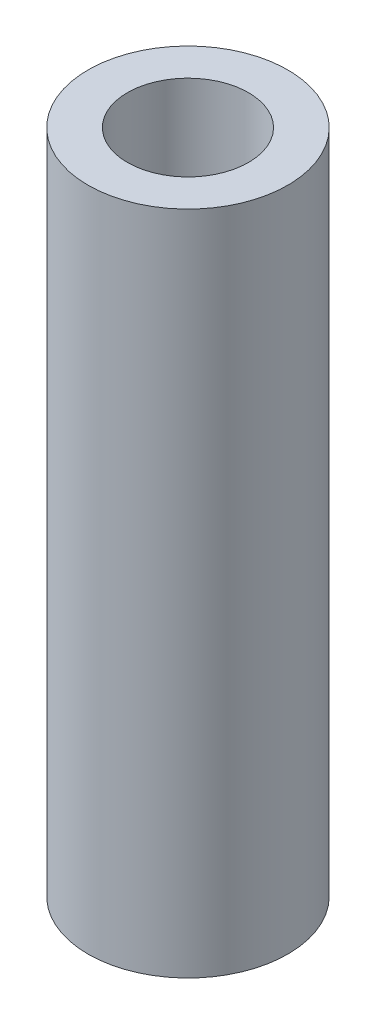
ISO-10303-21;
HEADER;
FILE_DESCRIPTION(('STEP AP214'),'2;1');
FILE_NAME('part.step','',(''),(''),'','','');
FILE_SCHEMA(('AUTOMOTIVE_DESIGN { 1 0 10303 214 1 1 1 1 }'));
ENDSEC;
DATA;
#1=APPLICATION_CONTEXT('core data for automotive mechanical design processes');
#2=APPLICATION_PROTOCOL_DEFINITION('international standard','automotive_design',2000,#1);
#3=PRODUCT_CONTEXT('',#1,'mechanical');
#4=PRODUCT('Part','Part','',(#3));
#5=PRODUCT_RELATED_PRODUCT_CATEGORY('part','',(#4));
#6=PRODUCT_DEFINITION_FORMATION('','',#4);
#7=PRODUCT_DEFINITION_CONTEXT('part definition',#1,'design');
#8=PRODUCT_DEFINITION('design','',#6,#7);
#9=PRODUCT_DEFINITION_SHAPE('','',#8);
#10=(LENGTH_UNIT() NAMED_UNIT(*) SI_UNIT(.MILLI.,.METRE.));
#11=(NAMED_UNIT(*) PLANE_ANGLE_UNIT() SI_UNIT($,.RADIAN.));
#12=(NAMED_UNIT(*) SI_UNIT($,.STERADIAN.) SOLID_ANGLE_UNIT());
#13=UNCERTAINTY_MEASURE_WITH_UNIT(LENGTH_MEASURE(1.E-05),#10,'distance_accuracy_value','');
#14=(GEOMETRIC_REPRESENTATION_CONTEXT(3) GLOBAL_UNCERTAINTY_ASSIGNED_CONTEXT((#13)) GLOBAL_UNIT_ASSIGNED_CONTEXT((#10,
#11,#12)) REPRESENTATION_CONTEXT('',''));
#15=CARTESIAN_POINT('',(0.,0.,0.));
#16=DIRECTION('',(0.,0.,1.));
#17=DIRECTION('',(1.,0.,0.));
#18=AXIS2_PLACEMENT_3D('',#15,#16,#17);
#19=CARTESIAN_POINT('',(0.,11.,0.));
#20=DIRECTION('',(0.,1.,0.));
#21=DIRECTION('',(0.,0.,1.));
#22=AXIS2_PLACEMENT_3D('',#19,#20,#21);
#23=PLANE('',#22);
#24=CARTESIAN_POINT('',(0.,11.,0.));
#25=DIRECTION('',(0.,1.,0.));
#26=DIRECTION('',(0.,0.,1.));
#27=AXIS2_PLACEMENT_3D('',#24,#25,#26);
#28=CIRCLE('',#27,1.65);
#29=CARTESIAN_POINT('',(0.,11.,1.65));
#30=VERTEX_POINT('',#29);
#31=EDGE_CURVE('E10',#30,#30,#28,.T.);
#32=ORIENTED_EDGE('',*,*,#31,.T.);
#33=EDGE_LOOP('',(#32));
#34=FACE_BOUND('',#33,.T.);
#35=CARTESIAN_POINT('',(0.,11.,0.));
#36=DIRECTION('',(0.,1.,0.));
#37=DIRECTION('',(0.,0.,1.));
#38=AXIS2_PLACEMENT_3D('',#35,#36,#37);
#39=CIRCLE('',#38,1.);
#40=CARTESIAN_POINT('',(0.,11.,1.));
#41=VERTEX_POINT('',#40);
#42=EDGE_CURVE('E44',#41,#41,#39,.T.);
#43=ORIENTED_EDGE('',*,*,#42,.F.);
#44=EDGE_LOOP('',(#43));
#45=FACE_BOUND('',#44,.T.);
#46=ADVANCED_FACE('F33',(#34,#45),#23,.T.);
#47=CARTESIAN_POINT('',(0.,0.,0.));
#48=DIRECTION('',(0.,1.,0.));
#49=DIRECTION('',(0.,0.,1.));
#50=AXIS2_PLACEMENT_3D('',#47,#48,#49);
#51=PLANE('',#50);
#52=CARTESIAN_POINT('',(0.,0.,0.));
#53=DIRECTION('',(0.,1.,0.));
#54=DIRECTION('',(0.,0.,1.));
#55=AXIS2_PLACEMENT_3D('',#52,#53,#54);
#56=CIRCLE('',#55,1.65);
#57=CARTESIAN_POINT('',(0.,0.,1.65));
#58=VERTEX_POINT('',#57);
#59=EDGE_CURVE('E37',#58,#58,#56,.T.);
#60=ORIENTED_EDGE('',*,*,#59,.F.);
#61=EDGE_LOOP('',(#60));
#62=FACE_BOUND('',#61,.T.);
#63=CARTESIAN_POINT('',(0.,0.,0.));
#64=DIRECTION('',(0.,1.,0.));
#65=DIRECTION('',(0.,0.,1.));
#66=AXIS2_PLACEMENT_3D('',#63,#64,#65);
#67=CIRCLE('',#66,1.);
#68=CARTESIAN_POINT('',(0.,0.,1.));
#69=VERTEX_POINT('',#68);
#70=EDGE_CURVE('E46',#69,#69,#67,.T.);
#71=ORIENTED_EDGE('',*,*,#70,.T.);
#72=EDGE_LOOP('',(#71));
#73=FACE_BOUND('',#72,.T.);
#74=ADVANCED_FACE('F56',(#62,#73),#51,.F.);
#75=CARTESIAN_POINT('',(0.,11.,0.));
#76=DIRECTION('',(0.,-1.,0.));
#77=DIRECTION('',(0.,0.,-1.));
#78=AXIS2_PLACEMENT_3D('',#75,#76,#77);
#79=CYLINDRICAL_SURFACE('',#78,1.65);
#80=ORIENTED_EDGE('',*,*,#31,.F.);
#81=EDGE_LOOP('',(#80));
#82=FACE_BOUND('',#81,.T.);
#83=ORIENTED_EDGE('',*,*,#59,.T.);
#84=EDGE_LOOP('',(#83));
#85=FACE_BOUND('',#84,.T.);
#86=ADVANCED_FACE('F35',(#82,#85),#79,.T.);
#87=CARTESIAN_POINT('',(0.,11.,0.));
#88=DIRECTION('',(0.,-1.,0.));
#89=DIRECTION('',(0.,0.,-1.));
#90=AXIS2_PLACEMENT_3D('',#87,#88,#89);
#91=CYLINDRICAL_SURFACE('',#90,1.);
#92=ORIENTED_EDGE('',*,*,#42,.T.);
#93=EDGE_LOOP('',(#92));
#94=FACE_BOUND('',#93,.T.);
#95=ORIENTED_EDGE('',*,*,#70,.F.);
#96=EDGE_LOOP('',(#95));
#97=FACE_BOUND('',#96,.T.);
#98=ADVANCED_FACE('F52',(#94,#97),#91,.F.);
#99=CLOSED_SHELL('',(#46,#74,#86,#98));
#100=MANIFOLD_SOLID_BREP('B2',#99);
#101=ADVANCED_BREP_SHAPE_REPRESENTATION('',(#18,#100),#14);
#102=SHAPE_DEFINITION_REPRESENTATION(#9,#101);
ENDSEC;
END-ISO-10303-21;
